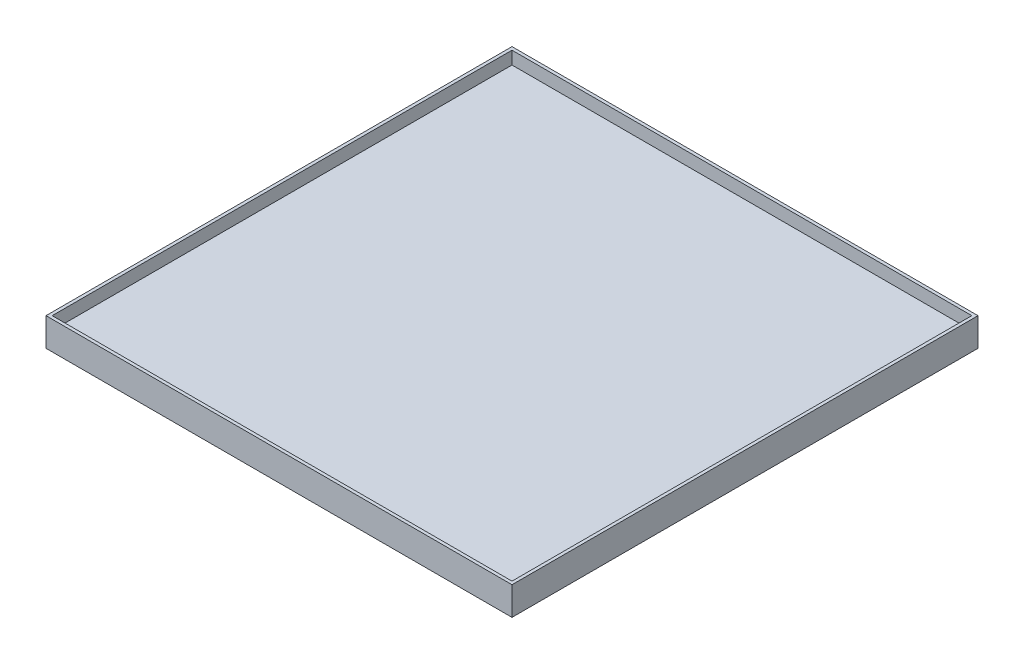
ISO-10303-21;
HEADER;
FILE_DESCRIPTION(('STEP AP214'),'2;1');
FILE_NAME('part.step','',(''),(''),'','','');
FILE_SCHEMA(('AUTOMOTIVE_DESIGN { 1 0 10303 214 1 1 1 1 }'));
ENDSEC;
DATA;
#1=APPLICATION_CONTEXT('core data for automotive mechanical design processes');
#2=APPLICATION_PROTOCOL_DEFINITION('international standard','automotive_design',2000,#1);
#3=PRODUCT_CONTEXT('',#1,'mechanical');
#4=PRODUCT('Part','Part','',(#3));
#5=PRODUCT_RELATED_PRODUCT_CATEGORY('part','',(#4));
#6=PRODUCT_DEFINITION_FORMATION('','',#4);
#7=PRODUCT_DEFINITION_CONTEXT('part definition',#1,'design');
#8=PRODUCT_DEFINITION('design','',#6,#7);
#9=PRODUCT_DEFINITION_SHAPE('','',#8);
#10=(LENGTH_UNIT() NAMED_UNIT(*) SI_UNIT(.MILLI.,.METRE.));
#11=(NAMED_UNIT(*) PLANE_ANGLE_UNIT() SI_UNIT($,.RADIAN.));
#12=(NAMED_UNIT(*) SI_UNIT($,.STERADIAN.) SOLID_ANGLE_UNIT());
#13=UNCERTAINTY_MEASURE_WITH_UNIT(LENGTH_MEASURE(1.E-05),#10,'distance_accuracy_value','');
#14=(GEOMETRIC_REPRESENTATION_CONTEXT(3) GLOBAL_UNCERTAINTY_ASSIGNED_CONTEXT((#13)) GLOBAL_UNIT_ASSIGNED_CONTEXT((#10,
#11,#12)) REPRESENTATION_CONTEXT('',''));
#15=CARTESIAN_POINT('',(0.,0.,0.));
#16=DIRECTION('',(0.,0.,1.));
#17=DIRECTION('',(1.,0.,0.));
#18=AXIS2_PLACEMENT_3D('',#15,#16,#17);
#19=CARTESIAN_POINT('',(0.,0.,0.));
#20=DIRECTION('',(0.,1.,0.));
#21=DIRECTION('',(0.,0.,1.));
#22=AXIS2_PLACEMENT_3D('',#19,#20,#21);
#23=PLANE('',#22);
#24=DIRECTION('',(0.,0.,-1.));
#25=VECTOR('',#24,1.);
#26=CARTESIAN_POINT('',(305.,0.,875.));
#27=LINE('',#26,#25);
#28=CARTESIAN_POINT('',(305.,0.,-305.));
#29=VERTEX_POINT('',#28);
#30=CARTESIAN_POINT('',(305.,0.,-875.));
#31=VERTEX_POINT('',#30);
#32=EDGE_CURVE('E361',#29,#31,#27,.T.);
#33=ORIENTED_EDGE('',*,*,#32,.F.);
#34=DIRECTION('',(1.,0.,0.));
#35=VECTOR('',#34,1.);
#36=CARTESIAN_POINT('',(-875.,0.,-305.));
#37=LINE('',#36,#35);
#38=CARTESIAN_POINT('',(-305.,0.,-305.));
#39=VERTEX_POINT('',#38);
#40=EDGE_CURVE('E469',#39,#29,#37,.T.);
#41=ORIENTED_EDGE('',*,*,#40,.F.);
#42=DIRECTION('',(0.,0.,1.));
#43=VECTOR('',#42,1.);
#44=CARTESIAN_POINT('',(-305.,0.,875.));
#45=LINE('',#44,#43);
#46=CARTESIAN_POINT('',(-305.,0.,-875.));
#47=VERTEX_POINT('',#46);
#48=EDGE_CURVE('E426',#47,#39,#45,.T.);
#49=ORIENTED_EDGE('',*,*,#48,.F.);
#50=DIRECTION('',(1.,0.,0.));
#51=VECTOR('',#50,1.);
#52=CARTESIAN_POINT('',(-875.,0.,-875.));
#53=LINE('',#52,#51);
#54=EDGE_CURVE('E552',#47,#31,#53,.T.);
#55=ORIENTED_EDGE('',*,*,#54,.T.);
#56=EDGE_LOOP('',(#33,#41,#49,#55));
#57=FACE_BOUND('',#56,.T.);
#58=ADVANCED_FACE('F33',(#57),#23,.F.);
#59=DIRECTION('',(0.,0.,1.));
#60=VECTOR('',#59,1.);
#61=CARTESIAN_POINT('',(335.,0.,875.));
#62=LINE('',#61,#60);
#63=CARTESIAN_POINT('',(335.,0.,-875.));
#64=VERTEX_POINT('',#63);
#65=CARTESIAN_POINT('',(335.,0.,-305.));
#66=VERTEX_POINT('',#65);
#67=EDGE_CURVE('E378',#64,#66,#62,.T.);
#68=ORIENTED_EDGE('',*,*,#67,.F.);
#69=CARTESIAN_POINT('',(875.,0.,-875.));
#70=VERTEX_POINT('',#69);
#71=EDGE_CURVE('E546',#64,#70,#53,.T.);
#72=ORIENTED_EDGE('',*,*,#71,.T.);
#73=DIRECTION('',(0.,0.,1.));
#74=VECTOR('',#73,1.);
#75=CARTESIAN_POINT('',(875.,0.,875.));
#76=LINE('',#75,#74);
#77=CARTESIAN_POINT('',(875.,0.,-305.));
#78=VERTEX_POINT('',#77);
#79=EDGE_CURVE('E553',#70,#78,#76,.T.);
#80=ORIENTED_EDGE('',*,*,#79,.T.);
#81=EDGE_CURVE('E453',#66,#78,#37,.T.);
#82=ORIENTED_EDGE('',*,*,#81,.F.);
#83=EDGE_LOOP('',(#68,#72,#80,#82));
#84=FACE_BOUND('',#83,.T.);
#85=ADVANCED_FACE('F689',(#84),#23,.F.);
#86=CARTESIAN_POINT('',(305.,0.,275.));
#87=VERTEX_POINT('',#86);
#88=CARTESIAN_POINT('',(305.,0.,-275.));
#89=VERTEX_POINT('',#88);
#90=EDGE_CURVE('E377',#87,#89,#27,.T.);
#91=ORIENTED_EDGE('',*,*,#90,.F.);
#92=DIRECTION('',(1.,0.,0.));
#93=VECTOR('',#92,1.);
#94=CARTESIAN_POINT('',(-875.,0.,275.));
#95=LINE('',#94,#93);
#96=CARTESIAN_POINT('',(-305.,0.,275.));
#97=VERTEX_POINT('',#96);
#98=EDGE_CURVE('E501',#97,#87,#95,.T.);
#99=ORIENTED_EDGE('',*,*,#98,.F.);
#100=CARTESIAN_POINT('',(-305.,0.,-275.));
#101=VERTEX_POINT('',#100);
#102=EDGE_CURVE('E428',#101,#97,#45,.T.);
#103=ORIENTED_EDGE('',*,*,#102,.F.);
#104=DIRECTION('',(-1.,0.,0.));
#105=VECTOR('',#104,1.);
#106=CARTESIAN_POINT('',(-875.,0.,-275.));
#107=LINE('',#106,#105);
#108=EDGE_CURVE('E473',#89,#101,#107,.T.);
#109=ORIENTED_EDGE('',*,*,#108,.F.);
#110=EDGE_LOOP('',(#91,#99,#103,#109));
#111=FACE_BOUND('',#110,.T.);
#112=ADVANCED_FACE('F601',(#111),#23,.F.);
#113=CARTESIAN_POINT('',(335.,0.,-275.));
#114=VERTEX_POINT('',#113);
#115=CARTESIAN_POINT('',(335.,0.,275.));
#116=VERTEX_POINT('',#115);
#117=EDGE_CURVE('E381',#114,#116,#62,.T.);
#118=ORIENTED_EDGE('',*,*,#117,.F.);
#119=CARTESIAN_POINT('',(875.,0.,-275.));
#120=VERTEX_POINT('',#119);
#121=EDGE_CURVE('E470',#120,#114,#107,.T.);
#122=ORIENTED_EDGE('',*,*,#121,.F.);
#123=CARTESIAN_POINT('',(875.,0.,275.000000000001));
#124=VERTEX_POINT('',#123);
#125=EDGE_CURVE('E556',#120,#124,#76,.T.);
#126=ORIENTED_EDGE('',*,*,#125,.T.);
#127=EDGE_CURVE('E485',#116,#124,#95,.T.);
#128=ORIENTED_EDGE('',*,*,#127,.F.);
#129=EDGE_LOOP('',(#118,#122,#126,#128));
#130=FACE_BOUND('',#129,.T.);
#131=ADVANCED_FACE('F645',(#130),#23,.F.);
#132=CARTESIAN_POINT('',(305.,0.,875.));
#133=VERTEX_POINT('',#132);
#134=CARTESIAN_POINT('',(305.,0.,305.));
#135=VERTEX_POINT('',#134);
#136=EDGE_CURVE('E373',#133,#135,#27,.T.);
#137=ORIENTED_EDGE('',*,*,#136,.F.);
#138=DIRECTION('',(-1.,0.,0.));
#139=VECTOR('',#138,1.);
#140=CARTESIAN_POINT('',(-875.,0.,875.));
#141=LINE('',#140,#139);
#142=CARTESIAN_POINT('',(-305.,0.,875.));
#143=VERTEX_POINT('',#142);
#144=EDGE_CURVE('E542',#133,#143,#141,.T.);
#145=ORIENTED_EDGE('',*,*,#144,.T.);
#146=CARTESIAN_POINT('',(-305.,0.,305.));
#147=VERTEX_POINT('',#146);
#148=EDGE_CURVE('E424',#147,#143,#45,.T.);
#149=ORIENTED_EDGE('',*,*,#148,.F.);
#150=DIRECTION('',(-1.,0.,0.));
#151=VECTOR('',#150,1.);
#152=CARTESIAN_POINT('',(-875.,0.,305.));
#153=LINE('',#152,#151);
#154=EDGE_CURVE('E505',#135,#147,#153,.T.);
#155=ORIENTED_EDGE('',*,*,#154,.F.);
#156=EDGE_LOOP('',(#137,#145,#149,#155));
#157=FACE_BOUND('',#156,.T.);
#158=ADVANCED_FACE('F859',(#157),#23,.F.);
#159=CARTESIAN_POINT('',(335.,0.,305.));
#160=VERTEX_POINT('',#159);
#161=CARTESIAN_POINT('',(335.,0.,875.));
#162=VERTEX_POINT('',#161);
#163=EDGE_CURVE('E376',#160,#162,#62,.T.);
#164=ORIENTED_EDGE('',*,*,#163,.F.);
#165=CARTESIAN_POINT('',(875.,0.,305.));
#166=VERTEX_POINT('',#165);
#167=EDGE_CURVE('E502',#166,#160,#153,.T.);
#168=ORIENTED_EDGE('',*,*,#167,.F.);
#169=CARTESIAN_POINT('',(875.,0.,875.));
#170=VERTEX_POINT('',#169);
#171=EDGE_CURVE('E551',#166,#170,#76,.T.);
#172=ORIENTED_EDGE('',*,*,#171,.T.);
#173=EDGE_CURVE('E538',#170,#162,#141,.T.);
#174=ORIENTED_EDGE('',*,*,#173,.T.);
#175=EDGE_LOOP('',(#164,#168,#172,#174));
#176=FACE_BOUND('',#175,.T.);
#177=ADVANCED_FACE('F648',(#176),#23,.F.);
#178=CARTESIAN_POINT('',(-875.,-50.,875.));
#179=DIRECTION('',(0.,0.,-1.));
#180=DIRECTION('',(-1.,0.,0.));
#181=AXIS2_PLACEMENT_3D('',#178,#179,#180);
#182=PLANE('',#181);
#183=ORIENTED_EDGE('',*,*,#144,.F.);
#184=DIRECTION('',(0.,1.,0.));
#185=VECTOR('',#184,1.);
#186=CARTESIAN_POINT('',(305.,-50.,875.));
#187=LINE('',#186,#185);
#188=CARTESIAN_POINT('',(305.,-50.,875.));
#189=VERTEX_POINT('',#188);
#190=EDGE_CURVE('E371',#189,#133,#187,.T.);
#191=ORIENTED_EDGE('',*,*,#190,.F.);
#192=DIRECTION('',(-1.,0.,0.));
#193=VECTOR('',#192,1.);
#194=CARTESIAN_POINT('',(-875.,-50.,875.));
#195=LINE('',#194,#193);
#196=CARTESIAN_POINT('',(-305.,-50.,875.));
#197=VERTEX_POINT('',#196);
#198=EDGE_CURVE('E521',#189,#197,#195,.T.);
#199=ORIENTED_EDGE('',*,*,#198,.T.);
#200=DIRECTION('',(0.,1.,0.));
#201=VECTOR('',#200,1.);
#202=CARTESIAN_POINT('',(-305.,-50.,875.));
#203=LINE('',#202,#201);
#204=EDGE_CURVE('E430',#197,#143,#203,.T.);
#205=ORIENTED_EDGE('',*,*,#204,.T.);
#206=EDGE_LOOP('',(#183,#191,#199,#205));
#207=FACE_BOUND('',#206,.T.);
#208=ADVANCED_FACE('F614',(#207),#182,.T.);
#209=CARTESIAN_POINT('',(875.,-50.,875.));
#210=VERTEX_POINT('',#209);
#211=CARTESIAN_POINT('',(335.,-50.,875.));
#212=VERTEX_POINT('',#211);
#213=EDGE_CURVE('E518',#210,#212,#195,.T.);
#214=ORIENTED_EDGE('',*,*,#213,.T.);
#215=DIRECTION('',(0.,1.,0.));
#216=VECTOR('',#215,1.);
#217=CARTESIAN_POINT('',(335.,-50.,875.));
#218=LINE('',#217,#216);
#219=EDGE_CURVE('E384',#212,#162,#218,.T.);
#220=ORIENTED_EDGE('',*,*,#219,.T.);
#221=ORIENTED_EDGE('',*,*,#173,.F.);
#222=DIRECTION('',(0.,1.,0.));
#223=VECTOR('',#222,1.);
#224=CARTESIAN_POINT('',(875.,-50.,875.));
#225=LINE('',#224,#223);
#226=EDGE_CURVE('E536',#210,#170,#225,.T.);
#227=ORIENTED_EDGE('',*,*,#226,.F.);
#228=EDGE_LOOP('',(#214,#220,#221,#227));
#229=FACE_BOUND('',#228,.T.);
#230=ADVANCED_FACE('F657',(#229),#182,.T.);
#231=CARTESIAN_POINT('',(-875.,-50.,-875.));
#232=DIRECTION('',(0.,0.,1.));
#233=DIRECTION('',(1.,0.,0.));
#234=AXIS2_PLACEMENT_3D('',#231,#232,#233);
#235=PLANE('',#234);
#236=DIRECTION('',(1.,0.,0.));
#237=VECTOR('',#236,1.);
#238=CARTESIAN_POINT('',(-875.,-50.,-875.));
#239=LINE('',#238,#237);
#240=CARTESIAN_POINT('',(-305.,-50.,-875.));
#241=VERTEX_POINT('',#240);
#242=CARTESIAN_POINT('',(305.,-50.,-875.));
#243=VERTEX_POINT('',#242);
#244=EDGE_CURVE('E532',#241,#243,#239,.T.);
#245=ORIENTED_EDGE('',*,*,#244,.T.);
#246=DIRECTION('',(0.,1.,0.));
#247=VECTOR('',#246,1.);
#248=CARTESIAN_POINT('',(305.,-50.,-875.));
#249=LINE('',#248,#247);
#250=EDGE_CURVE('E389',#243,#31,#249,.T.);
#251=ORIENTED_EDGE('',*,*,#250,.T.);
#252=ORIENTED_EDGE('',*,*,#54,.F.);
#253=DIRECTION('',(0.,1.,0.));
#254=VECTOR('',#253,1.);
#255=CARTESIAN_POINT('',(-305.,-50.,-875.));
#256=LINE('',#255,#254);
#257=EDGE_CURVE('E433',#241,#47,#256,.T.);
#258=ORIENTED_EDGE('',*,*,#257,.F.);
#259=EDGE_LOOP('',(#245,#251,#252,#258));
#260=FACE_BOUND('',#259,.T.);
#261=ADVANCED_FACE('F814',(#260),#235,.T.);
#262=ORIENTED_EDGE('',*,*,#71,.F.);
#263=DIRECTION('',(0.,1.,0.));
#264=VECTOR('',#263,1.);
#265=CARTESIAN_POINT('',(335.,-50.,-875.));
#266=LINE('',#265,#264);
#267=CARTESIAN_POINT('',(335.,-50.,-875.));
#268=VERTEX_POINT('',#267);
#269=EDGE_CURVE('E386',#268,#64,#266,.T.);
#270=ORIENTED_EDGE('',*,*,#269,.F.);
#271=CARTESIAN_POINT('',(875.,-50.,-875.));
#272=VERTEX_POINT('',#271);
#273=EDGE_CURVE('E526',#268,#272,#239,.T.);
#274=ORIENTED_EDGE('',*,*,#273,.T.);
#275=DIRECTION('',(0.,1.,0.));
#276=VECTOR('',#275,1.);
#277=CARTESIAN_POINT('',(875.,-50.,-875.));
#278=LINE('',#277,#276);
#279=EDGE_CURVE('E559',#272,#70,#278,.T.);
#280=ORIENTED_EDGE('',*,*,#279,.T.);
#281=EDGE_LOOP('',(#262,#270,#274,#280));
#282=FACE_BOUND('',#281,.T.);
#283=ADVANCED_FACE('F807',(#282),#235,.T.);
#284=CARTESIAN_POINT('',(-875.,-50.,275.));
#285=DIRECTION('',(0.,0.,1.));
#286=DIRECTION('',(1.,0.,0.));
#287=AXIS2_PLACEMENT_3D('',#284,#285,#286);
#288=PLANE('',#287);
#289=DIRECTION('',(0.,1.,0.));
#290=VECTOR('',#289,1.);
#291=CARTESIAN_POINT('',(305.,-50.,275.));
#292=LINE('',#291,#290);
#293=CARTESIAN_POINT('',(305.,-50.,275.));
#294=VERTEX_POINT('',#293);
#295=EDGE_CURVE('E410',#294,#87,#292,.T.);
#296=ORIENTED_EDGE('',*,*,#295,.F.);
#297=DIRECTION('',(1.,0.,0.));
#298=VECTOR('',#297,1.);
#299=CARTESIAN_POINT('',(-875.,-50.,275.));
#300=LINE('',#299,#298);
#301=CARTESIAN_POINT('',(-305.,-50.,275.));
#302=VERTEX_POINT('',#301);
#303=EDGE_CURVE('E490',#302,#294,#300,.T.);
#304=ORIENTED_EDGE('',*,*,#303,.F.);
#305=DIRECTION('',(0.,-1.,0.));
#306=VECTOR('',#305,1.);
#307=CARTESIAN_POINT('',(-305.,-50.,275.));
#308=LINE('',#307,#306);
#309=EDGE_CURVE('E444',#97,#302,#308,.T.);
#310=ORIENTED_EDGE('',*,*,#309,.F.);
#311=ORIENTED_EDGE('',*,*,#98,.T.);
#312=EDGE_LOOP('',(#296,#304,#310,#311));
#313=FACE_BOUND('',#312,.T.);
#314=ADVANCED_FACE('F627',(#313),#288,.F.);
#315=DIRECTION('',(0.,-1.,0.));
#316=VECTOR('',#315,1.);
#317=CARTESIAN_POINT('',(335.,-50.,275.));
#318=LINE('',#317,#316);
#319=CARTESIAN_POINT('',(335.,-50.,275.));
#320=VERTEX_POINT('',#319);
#321=EDGE_CURVE('E399',#116,#320,#318,.T.);
#322=ORIENTED_EDGE('',*,*,#321,.F.);
#323=ORIENTED_EDGE('',*,*,#127,.T.);
#324=DIRECTION('',(0.,1.,0.));
#325=VECTOR('',#324,1.);
#326=CARTESIAN_POINT('',(875.,-50.,275.000000000001));
#327=LINE('',#326,#325);
#328=CARTESIAN_POINT('',(875.,-50.,275.));
#329=VERTEX_POINT('',#328);
#330=EDGE_CURVE('E511',#329,#124,#327,.T.);
#331=ORIENTED_EDGE('',*,*,#330,.F.);
#332=EDGE_CURVE('E491',#320,#329,#300,.T.);
#333=ORIENTED_EDGE('',*,*,#332,.F.);
#334=EDGE_LOOP('',(#322,#323,#331,#333));
#335=FACE_BOUND('',#334,.T.);
#336=ADVANCED_FACE('F640',(#335),#288,.F.);
#337=CARTESIAN_POINT('',(-875.,-50.,305.));
#338=DIRECTION('',(0.,0.,-1.));
#339=DIRECTION('',(-1.,0.,0.));
#340=AXIS2_PLACEMENT_3D('',#337,#338,#339);
#341=PLANE('',#340);
#342=DIRECTION('',(0.,-1.,0.));
#343=VECTOR('',#342,1.);
#344=CARTESIAN_POINT('',(305.,-50.,305.));
#345=LINE('',#344,#343);
#346=CARTESIAN_POINT('',(305.,-50.,305.));
#347=VERTEX_POINT('',#346);
#348=EDGE_CURVE('E407',#135,#347,#345,.T.);
#349=ORIENTED_EDGE('',*,*,#348,.F.);
#350=ORIENTED_EDGE('',*,*,#154,.T.);
#351=DIRECTION('',(0.,1.,0.));
#352=VECTOR('',#351,1.);
#353=CARTESIAN_POINT('',(-305.,-50.,305.));
#354=LINE('',#353,#352);
#355=CARTESIAN_POINT('',(-305.,-50.,305.));
#356=VERTEX_POINT('',#355);
#357=EDGE_CURVE('E441',#356,#147,#354,.T.);
#358=ORIENTED_EDGE('',*,*,#357,.F.);
#359=DIRECTION('',(-1.,0.,0.));
#360=VECTOR('',#359,1.);
#361=CARTESIAN_POINT('',(-875.,-50.,305.));
#362=LINE('',#361,#360);
#363=EDGE_CURVE('E496',#347,#356,#362,.T.);
#364=ORIENTED_EDGE('',*,*,#363,.F.);
#365=EDGE_LOOP('',(#349,#350,#358,#364));
#366=FACE_BOUND('',#365,.T.);
#367=ADVANCED_FACE('F858',(#366),#341,.F.);
#368=DIRECTION('',(0.,1.,0.));
#369=VECTOR('',#368,1.);
#370=CARTESIAN_POINT('',(335.,-50.,305.));
#371=LINE('',#370,#369);
#372=CARTESIAN_POINT('',(335.,-50.,305.));
#373=VERTEX_POINT('',#372);
#374=EDGE_CURVE('E396',#373,#160,#371,.T.);
#375=ORIENTED_EDGE('',*,*,#374,.F.);
#376=CARTESIAN_POINT('',(875.,-50.,305.000000000001));
#377=VERTEX_POINT('',#376);
#378=EDGE_CURVE('E492',#377,#373,#362,.T.);
#379=ORIENTED_EDGE('',*,*,#378,.F.);
#380=DIRECTION('',(0.,1.,0.));
#381=VECTOR('',#380,1.);
#382=CARTESIAN_POINT('',(875.,-50.,305.000000000001));
#383=LINE('',#382,#381);
#384=EDGE_CURVE('E508',#377,#166,#383,.T.);
#385=ORIENTED_EDGE('',*,*,#384,.T.);
#386=ORIENTED_EDGE('',*,*,#167,.T.);
#387=EDGE_LOOP('',(#375,#379,#385,#386));
#388=FACE_BOUND('',#387,.T.);
#389=ADVANCED_FACE('F1096',(#388),#341,.F.);
#390=CARTESIAN_POINT('',(-875.,-50.,-305.));
#391=DIRECTION('',(0.,0.,1.));
#392=DIRECTION('',(1.,0.,0.));
#393=AXIS2_PLACEMENT_3D('',#390,#391,#392);
#394=PLANE('',#393);
#395=DIRECTION('',(0.,1.,0.));
#396=VECTOR('',#395,1.);
#397=CARTESIAN_POINT('',(305.,-50.,-305.));
#398=LINE('',#397,#396);
#399=CARTESIAN_POINT('',(305.,-50.,-305.));
#400=VERTEX_POINT('',#399);
#401=EDGE_CURVE('E404',#400,#29,#398,.T.);
#402=ORIENTED_EDGE('',*,*,#401,.F.);
#403=DIRECTION('',(1.,0.,0.));
#404=VECTOR('',#403,1.);
#405=CARTESIAN_POINT('',(-875.,-50.,-305.));
#406=LINE('',#405,#404);
#407=CARTESIAN_POINT('',(-305.,-50.,-305.));
#408=VERTEX_POINT('',#407);
#409=EDGE_CURVE('E458',#408,#400,#406,.T.);
#410=ORIENTED_EDGE('',*,*,#409,.F.);
#411=DIRECTION('',(0.,-1.,0.));
#412=VECTOR('',#411,1.);
#413=CARTESIAN_POINT('',(-305.,-50.,-305.));
#414=LINE('',#413,#412);
#415=EDGE_CURVE('E438',#39,#408,#414,.T.);
#416=ORIENTED_EDGE('',*,*,#415,.F.);
#417=ORIENTED_EDGE('',*,*,#40,.T.);
#418=EDGE_LOOP('',(#402,#410,#416,#417));
#419=FACE_BOUND('',#418,.T.);
#420=ADVANCED_FACE('F793',(#419),#394,.F.);
#421=DIRECTION('',(0.,-1.,0.));
#422=VECTOR('',#421,1.);
#423=CARTESIAN_POINT('',(335.,-50.,-305.));
#424=LINE('',#423,#422);
#425=CARTESIAN_POINT('',(335.,-50.,-305.));
#426=VERTEX_POINT('',#425);
#427=EDGE_CURVE('E393',#66,#426,#424,.T.);
#428=ORIENTED_EDGE('',*,*,#427,.F.);
#429=ORIENTED_EDGE('',*,*,#81,.T.);
#430=DIRECTION('',(0.,1.,0.));
#431=VECTOR('',#430,1.);
#432=CARTESIAN_POINT('',(875.,-50.,-305.));
#433=LINE('',#432,#431);
#434=CARTESIAN_POINT('',(875.,-50.,-305.));
#435=VERTEX_POINT('',#434);
#436=EDGE_CURVE('E479',#435,#78,#433,.T.);
#437=ORIENTED_EDGE('',*,*,#436,.F.);
#438=EDGE_CURVE('E459',#426,#435,#406,.T.);
#439=ORIENTED_EDGE('',*,*,#438,.F.);
#440=EDGE_LOOP('',(#428,#429,#437,#439));
#441=FACE_BOUND('',#440,.T.);
#442=ADVANCED_FACE('F681',(#441),#394,.F.);
#443=CARTESIAN_POINT('',(-875.,-50.,-275.));
#444=DIRECTION('',(0.,0.,-1.));
#445=DIRECTION('',(-1.,0.,0.));
#446=AXIS2_PLACEMENT_3D('',#443,#444,#445);
#447=PLANE('',#446);
#448=DIRECTION('',(0.,-1.,0.));
#449=VECTOR('',#448,1.);
#450=CARTESIAN_POINT('',(305.,-50.,-275.));
#451=LINE('',#450,#449);
#452=CARTESIAN_POINT('',(305.,-50.,-275.));
#453=VERTEX_POINT('',#452);
#454=EDGE_CURVE('E401',#89,#453,#451,.T.);
#455=ORIENTED_EDGE('',*,*,#454,.F.);
#456=ORIENTED_EDGE('',*,*,#108,.T.);
#457=DIRECTION('',(0.,1.,0.));
#458=VECTOR('',#457,1.);
#459=CARTESIAN_POINT('',(-305.,-50.,-275.));
#460=LINE('',#459,#458);
#461=CARTESIAN_POINT('',(-305.,-50.,-275.));
#462=VERTEX_POINT('',#461);
#463=EDGE_CURVE('E41',#462,#101,#460,.T.);
#464=ORIENTED_EDGE('',*,*,#463,.F.);
#465=DIRECTION('',(-1.,0.,0.));
#466=VECTOR('',#465,1.);
#467=CARTESIAN_POINT('',(-875.,-50.,-275.));
#468=LINE('',#467,#466);
#469=EDGE_CURVE('E464',#453,#462,#468,.T.);
#470=ORIENTED_EDGE('',*,*,#469,.F.);
#471=EDGE_LOOP('',(#455,#456,#464,#470));
#472=FACE_BOUND('',#471,.T.);
#473=ADVANCED_FACE('F670',(#472),#447,.F.);
#474=DIRECTION('',(0.,1.,0.));
#475=VECTOR('',#474,1.);
#476=CARTESIAN_POINT('',(335.,-50.,-275.));
#477=LINE('',#476,#475);
#478=CARTESIAN_POINT('',(335.,-50.,-275.));
#479=VERTEX_POINT('',#478);
#480=EDGE_CURVE('E391',#479,#114,#477,.T.);
#481=ORIENTED_EDGE('',*,*,#480,.F.);
#482=CARTESIAN_POINT('',(875.,-50.,-275.));
#483=VERTEX_POINT('',#482);
#484=EDGE_CURVE('E460',#483,#479,#468,.T.);
#485=ORIENTED_EDGE('',*,*,#484,.F.);
#486=DIRECTION('',(0.,1.,0.));
#487=VECTOR('',#486,1.);
#488=CARTESIAN_POINT('',(875.,-50.,-275.));
#489=LINE('',#488,#487);
#490=EDGE_CURVE('E476',#483,#120,#489,.T.);
#491=ORIENTED_EDGE('',*,*,#490,.T.);
#492=ORIENTED_EDGE('',*,*,#121,.T.);
#493=EDGE_LOOP('',(#481,#485,#491,#492));
#494=FACE_BOUND('',#493,.T.);
#495=ADVANCED_FACE('F667',(#494),#447,.F.);
#496=DIRECTION('',(0.,0.,-1.));
#497=VECTOR('',#496,1.);
#498=CARTESIAN_POINT('',(-335.,0.,875.));
#499=LINE('',#498,#497);
#500=CARTESIAN_POINT('',(-335.,0.,-305.));
#501=VERTEX_POINT('',#500);
#502=CARTESIAN_POINT('',(-335.,0.,-875.));
#503=VERTEX_POINT('',#502);
#504=EDGE_CURVE('E412',#501,#503,#499,.T.);
#505=ORIENTED_EDGE('',*,*,#504,.F.);
#506=CARTESIAN_POINT('',(-875.,0.,-305.));
#507=VERTEX_POINT('',#506);
#508=EDGE_CURVE('E465',#507,#501,#37,.T.);
#509=ORIENTED_EDGE('',*,*,#508,.F.);
#510=DIRECTION('',(0.,0.,-1.));
#511=VECTOR('',#510,1.);
#512=CARTESIAN_POINT('',(-875.,0.,875.));
#513=LINE('',#512,#511);
#514=CARTESIAN_POINT('',(-875.,0.,-875.));
#515=VERTEX_POINT('',#514);
#516=EDGE_CURVE('E541',#507,#515,#513,.T.);
#517=ORIENTED_EDGE('',*,*,#516,.T.);
#518=EDGE_CURVE('E548',#515,#503,#53,.T.);
#519=ORIENTED_EDGE('',*,*,#518,.T.);
#520=EDGE_LOOP('',(#505,#509,#517,#519));
#521=FACE_BOUND('',#520,.T.);
#522=ADVANCED_FACE('F669',(#521),#23,.F.);
#523=CARTESIAN_POINT('',(-335.,0.,275.));
#524=VERTEX_POINT('',#523);
#525=CARTESIAN_POINT('',(-335.,0.,-275.));
#526=VERTEX_POINT('',#525);
#527=EDGE_CURVE('E425',#524,#526,#499,.T.);
#528=ORIENTED_EDGE('',*,*,#527,.F.);
#529=CARTESIAN_POINT('',(-875.,0.,275.));
#530=VERTEX_POINT('',#529);
#531=EDGE_CURVE('E497',#530,#524,#95,.T.);
#532=ORIENTED_EDGE('',*,*,#531,.F.);
#533=CARTESIAN_POINT('',(-875.,0.,-275.));
#534=VERTEX_POINT('',#533);
#535=EDGE_CURVE('E547',#530,#534,#513,.T.);
#536=ORIENTED_EDGE('',*,*,#535,.T.);
#537=EDGE_CURVE('E468',#526,#534,#107,.T.);
#538=ORIENTED_EDGE('',*,*,#537,.F.);
#539=EDGE_LOOP('',(#528,#532,#536,#538));
#540=FACE_BOUND('',#539,.T.);
#541=ADVANCED_FACE('F677',(#540),#23,.F.);
#542=CARTESIAN_POINT('',(-335.,0.,875.));
#543=VERTEX_POINT('',#542);
#544=CARTESIAN_POINT('',(-335.,0.,305.));
#545=VERTEX_POINT('',#544);
#546=EDGE_CURVE('E422',#543,#545,#499,.T.);
#547=ORIENTED_EDGE('',*,*,#546,.F.);
#548=CARTESIAN_POINT('',(-875.,0.,875.));
#549=VERTEX_POINT('',#548);
#550=EDGE_CURVE('E517',#543,#549,#141,.T.);
#551=ORIENTED_EDGE('',*,*,#550,.T.);
#552=CARTESIAN_POINT('',(-875.,0.,305.));
#553=VERTEX_POINT('',#552);
#554=EDGE_CURVE('E543',#549,#553,#513,.T.);
#555=ORIENTED_EDGE('',*,*,#554,.T.);
#556=EDGE_CURVE('E500',#545,#553,#153,.T.);
#557=ORIENTED_EDGE('',*,*,#556,.F.);
#558=EDGE_LOOP('',(#547,#551,#555,#557));
#559=FACE_BOUND('',#558,.T.);
#560=ADVANCED_FACE('F680',(#559),#23,.F.);
#561=ORIENTED_EDGE('',*,*,#550,.F.);
#562=DIRECTION('',(0.,1.,0.));
#563=VECTOR('',#562,1.);
#564=CARTESIAN_POINT('',(-335.,-50.,875.));
#565=LINE('',#564,#563);
#566=CARTESIAN_POINT('',(-335.,-50.,875.));
#567=VERTEX_POINT('',#566);
#568=EDGE_CURVE('E420',#567,#543,#565,.T.);
#569=ORIENTED_EDGE('',*,*,#568,.F.);
#570=CARTESIAN_POINT('',(-875.,-50.,875.));
#571=VERTEX_POINT('',#570);
#572=EDGE_CURVE('E522',#567,#571,#195,.T.);
#573=ORIENTED_EDGE('',*,*,#572,.T.);
#574=DIRECTION('',(0.,1.,0.));
#575=VECTOR('',#574,1.);
#576=CARTESIAN_POINT('',(-875.,-50.,875.));
#577=LINE('',#576,#575);
#578=EDGE_CURVE('E565',#571,#549,#577,.T.);
#579=ORIENTED_EDGE('',*,*,#578,.T.);
#580=EDGE_LOOP('',(#561,#569,#573,#579));
#581=FACE_BOUND('',#580,.T.);
#582=ADVANCED_FACE('F823',(#581),#182,.T.);
#583=CARTESIAN_POINT('',(-875.,-50.,-875.));
#584=VERTEX_POINT('',#583);
#585=CARTESIAN_POINT('',(-335.,-50.,-875.));
#586=VERTEX_POINT('',#585);
#587=EDGE_CURVE('E528',#584,#586,#239,.T.);
#588=ORIENTED_EDGE('',*,*,#587,.T.);
#589=DIRECTION('',(0.,1.,0.));
#590=VECTOR('',#589,1.);
#591=CARTESIAN_POINT('',(-335.,-50.,-875.));
#592=LINE('',#591,#590);
#593=EDGE_CURVE('E435',#586,#503,#592,.T.);
#594=ORIENTED_EDGE('',*,*,#593,.T.);
#595=ORIENTED_EDGE('',*,*,#518,.F.);
#596=DIRECTION('',(0.,1.,0.));
#597=VECTOR('',#596,1.);
#598=CARTESIAN_POINT('',(-875.,-50.,-875.));
#599=LINE('',#598,#597);
#600=EDGE_CURVE('E562',#584,#515,#599,.T.);
#601=ORIENTED_EDGE('',*,*,#600,.F.);
#602=EDGE_LOOP('',(#588,#594,#595,#601));
#603=FACE_BOUND('',#602,.T.);
#604=ADVANCED_FACE('F817',(#603),#235,.T.);
#605=DIRECTION('',(0.,1.,0.));
#606=VECTOR('',#605,1.);
#607=CARTESIAN_POINT('',(-335.,-50.,275.));
#608=LINE('',#607,#606);
#609=CARTESIAN_POINT('',(-335.,-50.,275.));
#610=VERTEX_POINT('',#609);
#611=EDGE_CURVE('E451',#610,#524,#608,.T.);
#612=ORIENTED_EDGE('',*,*,#611,.F.);
#613=CARTESIAN_POINT('',(-875.,-50.,275.));
#614=VERTEX_POINT('',#613);
#615=EDGE_CURVE('E486',#614,#610,#300,.T.);
#616=ORIENTED_EDGE('',*,*,#615,.F.);
#617=DIRECTION('',(0.,1.,0.));
#618=VECTOR('',#617,1.);
#619=CARTESIAN_POINT('',(-875.,-50.,275.));
#620=LINE('',#619,#618);
#621=EDGE_CURVE('E514',#614,#530,#620,.T.);
#622=ORIENTED_EDGE('',*,*,#621,.T.);
#623=ORIENTED_EDGE('',*,*,#531,.T.);
#624=EDGE_LOOP('',(#612,#616,#622,#623));
#625=FACE_BOUND('',#624,.T.);
#626=ADVANCED_FACE('F827',(#625),#288,.F.);
#627=DIRECTION('',(0.,-1.,0.));
#628=VECTOR('',#627,1.);
#629=CARTESIAN_POINT('',(-335.,-50.,305.));
#630=LINE('',#629,#628);
#631=CARTESIAN_POINT('',(-335.,-50.,305.));
#632=VERTEX_POINT('',#631);
#633=EDGE_CURVE('E448',#545,#632,#630,.T.);
#634=ORIENTED_EDGE('',*,*,#633,.F.);
#635=ORIENTED_EDGE('',*,*,#556,.T.);
#636=DIRECTION('',(0.,1.,0.));
#637=VECTOR('',#636,1.);
#638=CARTESIAN_POINT('',(-875.,-50.,305.));
#639=LINE('',#638,#637);
#640=CARTESIAN_POINT('',(-875.,-50.,305.000000000001));
#641=VERTEX_POINT('',#640);
#642=EDGE_CURVE('E495',#641,#553,#639,.T.);
#643=ORIENTED_EDGE('',*,*,#642,.F.);
#644=EDGE_CURVE('E489',#632,#641,#362,.T.);
#645=ORIENTED_EDGE('',*,*,#644,.F.);
#646=EDGE_LOOP('',(#634,#635,#643,#645));
#647=FACE_BOUND('',#646,.T.);
#648=ADVANCED_FACE('F833',(#647),#341,.F.);
#649=DIRECTION('',(0.,1.,0.));
#650=VECTOR('',#649,1.);
#651=CARTESIAN_POINT('',(-335.,-50.,-305.));
#652=LINE('',#651,#650);
#653=CARTESIAN_POINT('',(-335.,-50.,-305.));
#654=VERTEX_POINT('',#653);
#655=EDGE_CURVE('E446',#654,#501,#652,.T.);
#656=ORIENTED_EDGE('',*,*,#655,.F.);
#657=CARTESIAN_POINT('',(-875.,-50.,-305.));
#658=VERTEX_POINT('',#657);
#659=EDGE_CURVE('E454',#658,#654,#406,.T.);
#660=ORIENTED_EDGE('',*,*,#659,.F.);
#661=DIRECTION('',(0.,1.,0.));
#662=VECTOR('',#661,1.);
#663=CARTESIAN_POINT('',(-875.,-50.,-305.));
#664=LINE('',#663,#662);
#665=EDGE_CURVE('E482',#658,#507,#664,.T.);
#666=ORIENTED_EDGE('',*,*,#665,.T.);
#667=ORIENTED_EDGE('',*,*,#508,.T.);
#668=EDGE_LOOP('',(#656,#660,#666,#667));
#669=FACE_BOUND('',#668,.T.);
#670=ADVANCED_FACE('F686',(#669),#394,.F.);
#671=DIRECTION('',(0.,-1.,0.));
#672=VECTOR('',#671,1.);
#673=CARTESIAN_POINT('',(-335.,-50.,-275.));
#674=LINE('',#673,#672);
#675=CARTESIAN_POINT('',(-335.,-50.,-275.));
#676=VERTEX_POINT('',#675);
#677=EDGE_CURVE('E11',#526,#676,#674,.T.);
#678=ORIENTED_EDGE('',*,*,#677,.F.);
#679=ORIENTED_EDGE('',*,*,#537,.T.);
#680=DIRECTION('',(0.,1.,0.));
#681=VECTOR('',#680,1.);
#682=CARTESIAN_POINT('',(-875.,-50.,-275.));
#683=LINE('',#682,#681);
#684=CARTESIAN_POINT('',(-875.,-50.,-275.));
#685=VERTEX_POINT('',#684);
#686=EDGE_CURVE('E463',#685,#534,#683,.T.);
#687=ORIENTED_EDGE('',*,*,#686,.F.);
#688=EDGE_CURVE('E457',#676,#685,#468,.T.);
#689=ORIENTED_EDGE('',*,*,#688,.F.);
#690=EDGE_LOOP('',(#678,#679,#687,#689));
#691=FACE_BOUND('',#690,.T.);
#692=ADVANCED_FACE('F672',(#691),#447,.F.);
#693=CARTESIAN_POINT('',(-875.,-50.,875.));
#694=DIRECTION('',(1.,0.,0.));
#695=DIRECTION('',(0.,0.,-1.));
#696=AXIS2_PLACEMENT_3D('',#693,#694,#695);
#697=PLANE('',#696);
#698=ORIENTED_EDGE('',*,*,#516,.F.);
#699=ORIENTED_EDGE('',*,*,#665,.F.);
#700=DIRECTION('',(0.,0.,-1.));
#701=VECTOR('',#700,1.);
#702=CARTESIAN_POINT('',(-875.,-50.,875.));
#703=LINE('',#702,#701);
#704=EDGE_CURVE('E520',#658,#584,#703,.T.);
#705=ORIENTED_EDGE('',*,*,#704,.T.);
#706=ORIENTED_EDGE('',*,*,#600,.T.);
#707=EDGE_LOOP('',(#698,#699,#705,#706));
#708=FACE_BOUND('',#707,.T.);
#709=ADVANCED_FACE('F685',(#708),#697,.T.);
#710=EDGE_CURVE('E527',#614,#685,#703,.T.);
#711=ORIENTED_EDGE('',*,*,#710,.T.);
#712=ORIENTED_EDGE('',*,*,#686,.T.);
#713=ORIENTED_EDGE('',*,*,#535,.F.);
#714=ORIENTED_EDGE('',*,*,#621,.F.);
#715=EDGE_LOOP('',(#711,#712,#713,#714));
#716=FACE_BOUND('',#715,.T.);
#717=ADVANCED_FACE('F771',(#716),#697,.T.);
#718=CARTESIAN_POINT('',(875.,-50.,875.));
#719=DIRECTION('',(-1.,0.,0.));
#720=DIRECTION('',(0.,0.,1.));
#721=AXIS2_PLACEMENT_3D('',#718,#719,#720);
#722=PLANE('',#721);
#723=DIRECTION('',(0.,0.,1.));
#724=VECTOR('',#723,1.);
#725=CARTESIAN_POINT('',(875.,-50.,875.));
#726=LINE('',#725,#724);
#727=EDGE_CURVE('E533',#272,#435,#726,.T.);
#728=ORIENTED_EDGE('',*,*,#727,.T.);
#729=ORIENTED_EDGE('',*,*,#436,.T.);
#730=ORIENTED_EDGE('',*,*,#79,.F.);
#731=ORIENTED_EDGE('',*,*,#279,.F.);
#732=EDGE_LOOP('',(#728,#729,#730,#731));
#733=FACE_BOUND('',#732,.T.);
#734=ADVANCED_FACE('F801',(#733),#722,.T.);
#735=ORIENTED_EDGE('',*,*,#125,.F.);
#736=ORIENTED_EDGE('',*,*,#490,.F.);
#737=EDGE_CURVE('E537',#483,#329,#726,.T.);
#738=ORIENTED_EDGE('',*,*,#737,.T.);
#739=ORIENTED_EDGE('',*,*,#330,.T.);
#740=EDGE_LOOP('',(#735,#736,#738,#739));
#741=FACE_BOUND('',#740,.T.);
#742=ADVANCED_FACE('F638',(#741),#722,.T.);
#743=EDGE_CURVE('E523',#571,#641,#703,.T.);
#744=ORIENTED_EDGE('',*,*,#743,.T.);
#745=ORIENTED_EDGE('',*,*,#642,.T.);
#746=ORIENTED_EDGE('',*,*,#554,.F.);
#747=ORIENTED_EDGE('',*,*,#578,.F.);
#748=EDGE_LOOP('',(#744,#745,#746,#747));
#749=FACE_BOUND('',#748,.T.);
#750=ADVANCED_FACE('F853',(#749),#697,.T.);
#751=ORIENTED_EDGE('',*,*,#171,.F.);
#752=ORIENTED_EDGE('',*,*,#384,.F.);
#753=EDGE_CURVE('E531',#377,#210,#726,.T.);
#754=ORIENTED_EDGE('',*,*,#753,.T.);
#755=ORIENTED_EDGE('',*,*,#226,.T.);
#756=EDGE_LOOP('',(#751,#752,#754,#755));
#757=FACE_BOUND('',#756,.T.);
#758=ADVANCED_FACE('F653',(#757),#722,.T.);
#759=CARTESIAN_POINT('',(-905.,10.,-905.));
#760=DIRECTION('',(1.,0.,0.));
#761=DIRECTION('',(0.,0.,-1.));
#762=AXIS2_PLACEMENT_3D('',#759,#760,#761);
#763=PLANE('',#762);
#764=DIRECTION('',(0.,-1.,0.));
#765=VECTOR('',#764,1.);
#766=CARTESIAN_POINT('',(-905.,10.,-905.));
#767=LINE('',#766,#765);
#768=CARTESIAN_POINT('',(-905.,60.,-905.));
#769=VERTEX_POINT('',#768);
#770=CARTESIAN_POINT('',(-905.,-50.,-905.));
#771=VERTEX_POINT('',#770);
#772=EDGE_CURVE('E580',#769,#771,#767,.T.);
#773=ORIENTED_EDGE('',*,*,#772,.T.);
#774=DIRECTION('',(0.,0.,-1.));
#775=VECTOR('',#774,1.);
#776=CARTESIAN_POINT('',(-905.,-50.,905.));
#777=LINE('',#776,#775);
#778=CARTESIAN_POINT('',(-905.,-50.,905.));
#779=VERTEX_POINT('',#778);
#780=EDGE_CURVE('E568',#779,#771,#777,.T.);
#781=ORIENTED_EDGE('',*,*,#780,.F.);
#782=DIRECTION('',(0.,-1.,0.));
#783=VECTOR('',#782,1.);
#784=CARTESIAN_POINT('',(-905.,10.,905.));
#785=LINE('',#784,#783);
#786=CARTESIAN_POINT('',(-905.,60.,905.));
#787=VERTEX_POINT('',#786);
#788=EDGE_CURVE('E586',#787,#779,#785,.T.);
#789=ORIENTED_EDGE('',*,*,#788,.F.);
#790=DIRECTION('',(0.,0.,1.));
#791=VECTOR('',#790,1.);
#792=CARTESIAN_POINT('',(-905.,60.,-905.));
#793=LINE('',#792,#791);
#794=EDGE_CURVE('E328',#769,#787,#793,.T.);
#795=ORIENTED_EDGE('',*,*,#794,.F.);
#796=EDGE_LOOP('',(#773,#781,#789,#795));
#797=FACE_BOUND('',#796,.T.);
#798=ADVANCED_FACE('F35',(#797),#763,.F.);
#799=CARTESIAN_POINT('',(-905.,10.,905.));
#800=DIRECTION('',(0.,0.,-1.));
#801=DIRECTION('',(-1.,0.,0.));
#802=AXIS2_PLACEMENT_3D('',#799,#800,#801);
#803=PLANE('',#802);
#804=ORIENTED_EDGE('',*,*,#788,.T.);
#805=DIRECTION('',(-1.,0.,0.));
#806=VECTOR('',#805,1.);
#807=CARTESIAN_POINT('',(-905.,-50.,905.));
#808=LINE('',#807,#806);
#809=CARTESIAN_POINT('',(905.,-50.,905.));
#810=VERTEX_POINT('',#809);
#811=EDGE_CURVE('E577',#810,#779,#808,.T.);
#812=ORIENTED_EDGE('',*,*,#811,.F.);
#813=DIRECTION('',(0.,-1.,0.));
#814=VECTOR('',#813,1.);
#815=CARTESIAN_POINT('',(905.,10.,905.));
#816=LINE('',#815,#814);
#817=CARTESIAN_POINT('',(905.,60.,905.));
#818=VERTEX_POINT('',#817);
#819=EDGE_CURVE('E584',#818,#810,#816,.T.);
#820=ORIENTED_EDGE('',*,*,#819,.F.);
#821=DIRECTION('',(1.,0.,0.));
#822=VECTOR('',#821,1.);
#823=CARTESIAN_POINT('',(-905.,60.,905.));
#824=LINE('',#823,#822);
#825=EDGE_CURVE('E352',#787,#818,#824,.T.);
#826=ORIENTED_EDGE('',*,*,#825,.F.);
#827=EDGE_LOOP('',(#804,#812,#820,#826));
#828=FACE_BOUND('',#827,.T.);
#829=ADVANCED_FACE('F705',(#828),#803,.F.);
#830=CARTESIAN_POINT('',(905.,10.,-905.));
#831=DIRECTION('',(-1.,0.,0.));
#832=DIRECTION('',(0.,0.,1.));
#833=AXIS2_PLACEMENT_3D('',#830,#831,#832);
#834=PLANE('',#833);
#835=ORIENTED_EDGE('',*,*,#819,.T.);
#836=DIRECTION('',(0.,0.,1.));
#837=VECTOR('',#836,1.);
#838=CARTESIAN_POINT('',(905.,-50.,905.));
#839=LINE('',#838,#837);
#840=CARTESIAN_POINT('',(905.,-50.,-905.));
#841=VERTEX_POINT('',#840);
#842=EDGE_CURVE('E574',#841,#810,#839,.T.);
#843=ORIENTED_EDGE('',*,*,#842,.F.);
#844=DIRECTION('',(0.,-1.,0.));
#845=VECTOR('',#844,1.);
#846=CARTESIAN_POINT('',(905.,10.,-905.));
#847=LINE('',#846,#845);
#848=CARTESIAN_POINT('',(905.,60.,-905.));
#849=VERTEX_POINT('',#848);
#850=EDGE_CURVE('E582',#849,#841,#847,.T.);
#851=ORIENTED_EDGE('',*,*,#850,.F.);
#852=DIRECTION('',(0.,0.,-1.));
#853=VECTOR('',#852,1.);
#854=CARTESIAN_POINT('',(905.,60.,-905.));
#855=LINE('',#854,#853);
#856=EDGE_CURVE('E355',#818,#849,#855,.T.);
#857=ORIENTED_EDGE('',*,*,#856,.F.);
#858=EDGE_LOOP('',(#835,#843,#851,#857));
#859=FACE_BOUND('',#858,.T.);
#860=ADVANCED_FACE('F702',(#859),#834,.F.);
#861=CARTESIAN_POINT('',(-905.,10.,-905.));
#862=DIRECTION('',(0.,0.,1.));
#863=DIRECTION('',(1.,0.,0.));
#864=AXIS2_PLACEMENT_3D('',#861,#862,#863);
#865=PLANE('',#864);
#866=ORIENTED_EDGE('',*,*,#850,.T.);
#867=DIRECTION('',(1.,0.,0.));
#868=VECTOR('',#867,1.);
#869=CARTESIAN_POINT('',(-905.,-50.,-905.));
#870=LINE('',#869,#868);
#871=EDGE_CURVE('E571',#771,#841,#870,.T.);
#872=ORIENTED_EDGE('',*,*,#871,.F.);
#873=ORIENTED_EDGE('',*,*,#772,.F.);
#874=DIRECTION('',(-1.,0.,0.));
#875=VECTOR('',#874,1.);
#876=CARTESIAN_POINT('',(-905.,60.,-905.));
#877=LINE('',#876,#875);
#878=EDGE_CURVE('E358',#849,#769,#877,.T.);
#879=ORIENTED_EDGE('',*,*,#878,.F.);
#880=EDGE_LOOP('',(#866,#872,#873,#879));
#881=FACE_BOUND('',#880,.T.);
#882=ADVANCED_FACE('F699',(#881),#865,.F.);
#883=CARTESIAN_POINT('',(0.,-50.,0.));
#884=DIRECTION('',(0.,-1.,0.));
#885=DIRECTION('',(0.,0.,-1.));
#886=AXIS2_PLACEMENT_3D('',#883,#884,#885);
#887=PLANE('',#886);
#888=DIRECTION('',(0.,0.,1.));
#889=VECTOR('',#888,1.);
#890=CARTESIAN_POINT('',(335.,-50.,875.));
#891=LINE('',#890,#889);
#892=EDGE_CURVE('E372',#479,#320,#891,.T.);
#893=ORIENTED_EDGE('',*,*,#892,.T.);
#894=ORIENTED_EDGE('',*,*,#332,.T.);
#895=ORIENTED_EDGE('',*,*,#737,.F.);
#896=ORIENTED_EDGE('',*,*,#484,.T.);
#897=EDGE_LOOP('',(#893,#894,#895,#896));
#898=FACE_BOUND('',#897,.T.);
#899=DIRECTION('',(0.,0.,-1.));
#900=VECTOR('',#899,1.);
#901=CARTESIAN_POINT('',(305.,-50.,875.));
#902=LINE('',#901,#900);
#903=EDGE_CURVE('E362',#189,#347,#902,.T.);
#904=ORIENTED_EDGE('',*,*,#903,.T.);
#905=ORIENTED_EDGE('',*,*,#363,.T.);
#906=DIRECTION('',(0.,0.,1.));
#907=VECTOR('',#906,1.);
#908=CARTESIAN_POINT('',(-305.,-50.,875.));
#909=LINE('',#908,#907);
#910=EDGE_CURVE('E415',#356,#197,#909,.T.);
#911=ORIENTED_EDGE('',*,*,#910,.T.);
#912=ORIENTED_EDGE('',*,*,#198,.F.);
#913=EDGE_LOOP('',(#904,#905,#911,#912));
#914=FACE_BOUND('',#913,.T.);
#915=EDGE_CURVE('E368',#268,#426,#891,.T.);
#916=ORIENTED_EDGE('',*,*,#915,.T.);
#917=ORIENTED_EDGE('',*,*,#438,.T.);
#918=ORIENTED_EDGE('',*,*,#727,.F.);
#919=ORIENTED_EDGE('',*,*,#273,.F.);
#920=EDGE_LOOP('',(#916,#917,#918,#919));
#921=FACE_BOUND('',#920,.T.);
#922=ORIENTED_EDGE('',*,*,#303,.T.);
#923=EDGE_CURVE('E366',#294,#453,#902,.T.);
#924=ORIENTED_EDGE('',*,*,#923,.T.);
#925=ORIENTED_EDGE('',*,*,#469,.T.);
#926=EDGE_CURVE('E421',#462,#302,#909,.T.);
#927=ORIENTED_EDGE('',*,*,#926,.T.);
#928=EDGE_LOOP('',(#922,#924,#925,#927));
#929=FACE_BOUND('',#928,.T.);
#930=ORIENTED_EDGE('',*,*,#378,.T.);
#931=EDGE_CURVE('E365',#373,#212,#891,.T.);
#932=ORIENTED_EDGE('',*,*,#931,.T.);
#933=ORIENTED_EDGE('',*,*,#213,.F.);
#934=ORIENTED_EDGE('',*,*,#753,.F.);
#935=EDGE_LOOP('',(#930,#932,#933,#934));
#936=FACE_BOUND('',#935,.T.);
#937=ORIENTED_EDGE('',*,*,#409,.T.);
#938=EDGE_CURVE('E367',#400,#243,#902,.T.);
#939=ORIENTED_EDGE('',*,*,#938,.T.);
#940=ORIENTED_EDGE('',*,*,#244,.F.);
#941=EDGE_CURVE('E418',#241,#408,#909,.T.);
#942=ORIENTED_EDGE('',*,*,#941,.T.);
#943=EDGE_LOOP('',(#937,#939,#940,#942));
#944=FACE_BOUND('',#943,.T.);
#945=DIRECTION('',(0.,0.,-1.));
#946=VECTOR('',#945,1.);
#947=CARTESIAN_POINT('',(-335.,-50.,875.));
#948=LINE('',#947,#946);
#949=EDGE_CURVE('E416',#610,#676,#948,.T.);
#950=ORIENTED_EDGE('',*,*,#949,.T.);
#951=ORIENTED_EDGE('',*,*,#688,.T.);
#952=ORIENTED_EDGE('',*,*,#710,.F.);
#953=ORIENTED_EDGE('',*,*,#615,.T.);
#954=EDGE_LOOP('',(#950,#951,#952,#953));
#955=FACE_BOUND('',#954,.T.);
#956=EDGE_CURVE('E413',#567,#632,#948,.T.);
#957=ORIENTED_EDGE('',*,*,#956,.T.);
#958=ORIENTED_EDGE('',*,*,#644,.T.);
#959=ORIENTED_EDGE('',*,*,#743,.F.);
#960=ORIENTED_EDGE('',*,*,#572,.F.);
#961=EDGE_LOOP('',(#957,#958,#959,#960));
#962=FACE_BOUND('',#961,.T.);
#963=ORIENTED_EDGE('',*,*,#659,.T.);
#964=EDGE_CURVE('E417',#654,#586,#948,.T.);
#965=ORIENTED_EDGE('',*,*,#964,.T.);
#966=ORIENTED_EDGE('',*,*,#587,.F.);
#967=ORIENTED_EDGE('',*,*,#704,.F.);
#968=EDGE_LOOP('',(#963,#965,#966,#967));
#969=FACE_BOUND('',#968,.T.);
#970=ORIENTED_EDGE('',*,*,#780,.T.);
#971=ORIENTED_EDGE('',*,*,#871,.T.);
#972=ORIENTED_EDGE('',*,*,#842,.T.);
#973=ORIENTED_EDGE('',*,*,#811,.T.);
#974=EDGE_LOOP('',(#970,#971,#972,#973));
#975=FACE_BOUND('',#974,.T.);
#976=ADVANCED_FACE('F619',(#898,#914,#921,#929,#936,#944,#955,#962,#969,#975),#887,.T.);
#977=CARTESIAN_POINT('',(-305.,-50.,875.));
#978=DIRECTION('',(-1.,0.,0.));
#979=DIRECTION('',(0.,0.,1.));
#980=AXIS2_PLACEMENT_3D('',#977,#978,#979);
#981=PLANE('',#980);
#982=ORIENTED_EDGE('',*,*,#102,.T.);
#983=ORIENTED_EDGE('',*,*,#309,.T.);
#984=ORIENTED_EDGE('',*,*,#926,.F.);
#985=ORIENTED_EDGE('',*,*,#463,.T.);
#986=EDGE_LOOP('',(#982,#983,#984,#985));
#987=FACE_BOUND('',#986,.T.);
#988=ADVANCED_FACE('F592',(#987),#981,.F.);
#989=CARTESIAN_POINT('',(-335.,-50.,875.));
#990=DIRECTION('',(1.,0.,0.));
#991=DIRECTION('',(0.,0.,-1.));
#992=AXIS2_PLACEMENT_3D('',#989,#990,#991);
#993=PLANE('',#992);
#994=ORIENTED_EDGE('',*,*,#949,.F.);
#995=ORIENTED_EDGE('',*,*,#611,.T.);
#996=ORIENTED_EDGE('',*,*,#527,.T.);
#997=ORIENTED_EDGE('',*,*,#677,.T.);
#998=EDGE_LOOP('',(#994,#995,#996,#997));
#999=FACE_BOUND('',#998,.T.);
#1000=ADVANCED_FACE('F741',(#999),#993,.F.);
#1001=ORIENTED_EDGE('',*,*,#48,.T.);
#1002=ORIENTED_EDGE('',*,*,#415,.T.);
#1003=ORIENTED_EDGE('',*,*,#941,.F.);
#1004=ORIENTED_EDGE('',*,*,#257,.T.);
#1005=EDGE_LOOP('',(#1001,#1002,#1003,#1004));
#1006=FACE_BOUND('',#1005,.T.);
#1007=ADVANCED_FACE('F742',(#1006),#981,.F.);
#1008=ORIENTED_EDGE('',*,*,#964,.F.);
#1009=ORIENTED_EDGE('',*,*,#655,.T.);
#1010=ORIENTED_EDGE('',*,*,#504,.T.);
#1011=ORIENTED_EDGE('',*,*,#593,.F.);
#1012=EDGE_LOOP('',(#1008,#1009,#1010,#1011));
#1013=FACE_BOUND('',#1012,.T.);
#1014=ADVANCED_FACE('F746',(#1013),#993,.F.);
#1015=ORIENTED_EDGE('',*,*,#546,.T.);
#1016=ORIENTED_EDGE('',*,*,#633,.T.);
#1017=ORIENTED_EDGE('',*,*,#956,.F.);
#1018=ORIENTED_EDGE('',*,*,#568,.T.);
#1019=EDGE_LOOP('',(#1015,#1016,#1017,#1018));
#1020=FACE_BOUND('',#1019,.T.);
#1021=ADVANCED_FACE('F745',(#1020),#993,.F.);
#1022=ORIENTED_EDGE('',*,*,#910,.F.);
#1023=ORIENTED_EDGE('',*,*,#357,.T.);
#1024=ORIENTED_EDGE('',*,*,#148,.T.);
#1025=ORIENTED_EDGE('',*,*,#204,.F.);
#1026=EDGE_LOOP('',(#1022,#1023,#1024,#1025));
#1027=FACE_BOUND('',#1026,.T.);
#1028=ADVANCED_FACE('F608',(#1027),#981,.F.);
#1029=CARTESIAN_POINT('',(335.,-50.,875.));
#1030=DIRECTION('',(-1.,0.,0.));
#1031=DIRECTION('',(0.,0.,1.));
#1032=AXIS2_PLACEMENT_3D('',#1029,#1030,#1031);
#1033=PLANE('',#1032);
#1034=ORIENTED_EDGE('',*,*,#931,.F.);
#1035=ORIENTED_EDGE('',*,*,#374,.T.);
#1036=ORIENTED_EDGE('',*,*,#163,.T.);
#1037=ORIENTED_EDGE('',*,*,#219,.F.);
#1038=EDGE_LOOP('',(#1034,#1035,#1036,#1037));
#1039=FACE_BOUND('',#1038,.T.);
#1040=ADVANCED_FACE('F662',(#1039),#1033,.F.);
#1041=CARTESIAN_POINT('',(305.,-50.,875.));
#1042=DIRECTION('',(1.,0.,0.));
#1043=DIRECTION('',(0.,0.,-1.));
#1044=AXIS2_PLACEMENT_3D('',#1041,#1042,#1043);
#1045=PLANE('',#1044);
#1046=ORIENTED_EDGE('',*,*,#136,.T.);
#1047=ORIENTED_EDGE('',*,*,#348,.T.);
#1048=ORIENTED_EDGE('',*,*,#903,.F.);
#1049=ORIENTED_EDGE('',*,*,#190,.T.);
#1050=EDGE_LOOP('',(#1046,#1047,#1048,#1049));
#1051=FACE_BOUND('',#1050,.T.);
#1052=ADVANCED_FACE('F739',(#1051),#1045,.F.);
#1053=ORIENTED_EDGE('',*,*,#67,.T.);
#1054=ORIENTED_EDGE('',*,*,#427,.T.);
#1055=ORIENTED_EDGE('',*,*,#915,.F.);
#1056=ORIENTED_EDGE('',*,*,#269,.T.);
#1057=EDGE_LOOP('',(#1053,#1054,#1055,#1056));
#1058=FACE_BOUND('',#1057,.T.);
#1059=ADVANCED_FACE('F732',(#1058),#1033,.F.);
#1060=ORIENTED_EDGE('',*,*,#938,.F.);
#1061=ORIENTED_EDGE('',*,*,#401,.T.);
#1062=ORIENTED_EDGE('',*,*,#32,.T.);
#1063=ORIENTED_EDGE('',*,*,#250,.F.);
#1064=EDGE_LOOP('',(#1060,#1061,#1062,#1063));
#1065=FACE_BOUND('',#1064,.T.);
#1066=ADVANCED_FACE('F737',(#1065),#1045,.F.);
#1067=ORIENTED_EDGE('',*,*,#923,.F.);
#1068=ORIENTED_EDGE('',*,*,#295,.T.);
#1069=ORIENTED_EDGE('',*,*,#90,.T.);
#1070=ORIENTED_EDGE('',*,*,#454,.T.);
#1071=EDGE_LOOP('',(#1067,#1068,#1069,#1070));
#1072=FACE_BOUND('',#1071,.T.);
#1073=ADVANCED_FACE('F730',(#1072),#1045,.F.);
#1074=ORIENTED_EDGE('',*,*,#117,.T.);
#1075=ORIENTED_EDGE('',*,*,#321,.T.);
#1076=ORIENTED_EDGE('',*,*,#892,.F.);
#1077=ORIENTED_EDGE('',*,*,#480,.T.);
#1078=EDGE_LOOP('',(#1074,#1075,#1076,#1077));
#1079=FACE_BOUND('',#1078,.T.);
#1080=ADVANCED_FACE('F664',(#1079),#1033,.F.);
#1081=CARTESIAN_POINT('',(0.,60.,0.));
#1082=DIRECTION('',(0.,1.,0.));
#1083=DIRECTION('',(0.,0.,1.));
#1084=AXIS2_PLACEMENT_3D('',#1081,#1082,#1083);
#1085=PLANE('',#1084);
#1086=ORIENTED_EDGE('',*,*,#794,.T.);
#1087=ORIENTED_EDGE('',*,*,#825,.T.);
#1088=ORIENTED_EDGE('',*,*,#856,.T.);
#1089=ORIENTED_EDGE('',*,*,#878,.T.);
#1090=EDGE_LOOP('',(#1086,#1087,#1088,#1089));
#1091=FACE_BOUND('',#1090,.T.);
#1092=DIRECTION('',(0.,0.,1.));
#1093=VECTOR('',#1092,1.);
#1094=CARTESIAN_POINT('',(-893.,60.,-893.));
#1095=LINE('',#1094,#1093);
#1096=CARTESIAN_POINT('',(-893.,60.,-893.));
#1097=VERTEX_POINT('',#1096);
#1098=CARTESIAN_POINT('',(-893.,60.,893.));
#1099=VERTEX_POINT('',#1098);
#1100=EDGE_CURVE('E322',#1097,#1099,#1095,.T.);
#1101=ORIENTED_EDGE('',*,*,#1100,.F.);
#1102=DIRECTION('',(-1.,0.,0.));
#1103=VECTOR('',#1102,1.);
#1104=CARTESIAN_POINT('',(-893.,60.,-893.));
#1105=LINE('',#1104,#1103);
#1106=CARTESIAN_POINT('',(893.,60.,-893.));
#1107=VERTEX_POINT('',#1106);
#1108=EDGE_CURVE('E313',#1107,#1097,#1105,.T.);
#1109=ORIENTED_EDGE('',*,*,#1108,.F.);
#1110=DIRECTION('',(0.,0.,-1.));
#1111=VECTOR('',#1110,1.);
#1112=CARTESIAN_POINT('',(893.,60.,-893.));
#1113=LINE('',#1112,#1111);
#1114=CARTESIAN_POINT('',(893.,60.,893.));
#1115=VERTEX_POINT('',#1114);
#1116=EDGE_CURVE('E336',#1115,#1107,#1113,.T.);
#1117=ORIENTED_EDGE('',*,*,#1116,.F.);
#1118=DIRECTION('',(1.,0.,0.));
#1119=VECTOR('',#1118,1.);
#1120=CARTESIAN_POINT('',(-893.,60.,893.));
#1121=LINE('',#1120,#1119);
#1122=EDGE_CURVE('E334',#1099,#1115,#1121,.T.);
#1123=ORIENTED_EDGE('',*,*,#1122,.F.);
#1124=EDGE_LOOP('',(#1101,#1109,#1117,#1123));
#1125=FACE_BOUND('',#1124,.T.);
#1126=ADVANCED_FACE('F332',(#1091,#1125),#1085,.T.);
#1127=CARTESIAN_POINT('',(-893.,60.,-893.));
#1128=DIRECTION('',(0.,0.,1.));
#1129=DIRECTION('',(1.,0.,0.));
#1130=AXIS2_PLACEMENT_3D('',#1127,#1128,#1129);
#1131=PLANE('',#1130);
#1132=DIRECTION('',(-1.,0.,0.));
#1133=VECTOR('',#1132,1.);
#1134=CARTESIAN_POINT('',(-893.,10.,-893.));
#1135=LINE('',#1134,#1133);
#1136=CARTESIAN_POINT('',(893.,10.,-893.));
#1137=VERTEX_POINT('',#1136);
#1138=CARTESIAN_POINT('',(-893.,10.,-893.));
#1139=VERTEX_POINT('',#1138);
#1140=EDGE_CURVE('E48',#1137,#1139,#1135,.T.);
#1141=ORIENTED_EDGE('',*,*,#1140,.F.);
#1142=DIRECTION('',(0.,-1.,0.));
#1143=VECTOR('',#1142,1.);
#1144=CARTESIAN_POINT('',(893.,60.,-893.));
#1145=LINE('',#1144,#1143);
#1146=EDGE_CURVE('E318',#1107,#1137,#1145,.T.);
#1147=ORIENTED_EDGE('',*,*,#1146,.F.);
#1148=ORIENTED_EDGE('',*,*,#1108,.T.);
#1149=DIRECTION('',(0.,-1.,0.));
#1150=VECTOR('',#1149,1.);
#1151=CARTESIAN_POINT('',(-893.,60.,-893.));
#1152=LINE('',#1151,#1150);
#1153=EDGE_CURVE('E316',#1097,#1139,#1152,.T.);
#1154=ORIENTED_EDGE('',*,*,#1153,.T.);
#1155=EDGE_LOOP('',(#1141,#1147,#1148,#1154));
#1156=FACE_BOUND('',#1155,.T.);
#1157=ADVANCED_FACE('F315',(#1156),#1131,.T.);
#1158=CARTESIAN_POINT('',(-893.,60.,-893.));
#1159=DIRECTION('',(1.,0.,0.));
#1160=DIRECTION('',(0.,0.,-1.));
#1161=AXIS2_PLACEMENT_3D('',#1158,#1159,#1160);
#1162=PLANE('',#1161);
#1163=DIRECTION('',(0.,0.,1.));
#1164=VECTOR('',#1163,1.);
#1165=CARTESIAN_POINT('',(-893.,10.,-893.));
#1166=LINE('',#1165,#1164);
#1167=CARTESIAN_POINT('',(-893.,10.,893.));
#1168=VERTEX_POINT('',#1167);
#1169=EDGE_CURVE('E52',#1139,#1168,#1166,.T.);
#1170=ORIENTED_EDGE('',*,*,#1169,.F.);
#1171=ORIENTED_EDGE('',*,*,#1153,.F.);
#1172=ORIENTED_EDGE('',*,*,#1100,.T.);
#1173=DIRECTION('',(0.,-1.,0.));
#1174=VECTOR('',#1173,1.);
#1175=CARTESIAN_POINT('',(-893.,60.,893.));
#1176=LINE('',#1175,#1174);
#1177=EDGE_CURVE('E329',#1099,#1168,#1176,.T.);
#1178=ORIENTED_EDGE('',*,*,#1177,.T.);
#1179=EDGE_LOOP('',(#1170,#1171,#1172,#1178));
#1180=FACE_BOUND('',#1179,.T.);
#1181=ADVANCED_FACE('F326',(#1180),#1162,.T.);
#1182=CARTESIAN_POINT('',(-893.,60.,893.));
#1183=DIRECTION('',(0.,0.,-1.));
#1184=DIRECTION('',(-1.,0.,0.));
#1185=AXIS2_PLACEMENT_3D('',#1182,#1183,#1184);
#1186=PLANE('',#1185);
#1187=DIRECTION('',(1.,0.,0.));
#1188=VECTOR('',#1187,1.);
#1189=CARTESIAN_POINT('',(-893.,10.,893.));
#1190=LINE('',#1189,#1188);
#1191=CARTESIAN_POINT('',(893.,10.,893.));
#1192=VERTEX_POINT('',#1191);
#1193=EDGE_CURVE('E342',#1168,#1192,#1190,.T.);
#1194=ORIENTED_EDGE('',*,*,#1193,.F.);
#1195=ORIENTED_EDGE('',*,*,#1177,.F.);
#1196=ORIENTED_EDGE('',*,*,#1122,.T.);
#1197=DIRECTION('',(0.,-1.,0.));
#1198=VECTOR('',#1197,1.);
#1199=CARTESIAN_POINT('',(893.,60.,893.));
#1200=LINE('',#1199,#1198);
#1201=EDGE_CURVE('E346',#1115,#1192,#1200,.T.);
#1202=ORIENTED_EDGE('',*,*,#1201,.T.);
#1203=EDGE_LOOP('',(#1194,#1195,#1196,#1202));
#1204=FACE_BOUND('',#1203,.T.);
#1205=ADVANCED_FACE('F923',(#1204),#1186,.T.);
#1206=CARTESIAN_POINT('',(893.,60.,-893.));
#1207=DIRECTION('',(-1.,0.,0.));
#1208=DIRECTION('',(0.,0.,1.));
#1209=AXIS2_PLACEMENT_3D('',#1206,#1207,#1208);
#1210=PLANE('',#1209);
#1211=DIRECTION('',(0.,0.,-1.));
#1212=VECTOR('',#1211,1.);
#1213=CARTESIAN_POINT('',(893.,10.,-893.));
#1214=LINE('',#1213,#1212);
#1215=EDGE_CURVE('E323',#1192,#1137,#1214,.T.);
#1216=ORIENTED_EDGE('',*,*,#1215,.F.);
#1217=ORIENTED_EDGE('',*,*,#1201,.F.);
#1218=ORIENTED_EDGE('',*,*,#1116,.T.);
#1219=ORIENTED_EDGE('',*,*,#1146,.T.);
#1220=EDGE_LOOP('',(#1216,#1217,#1218,#1219));
#1221=FACE_BOUND('',#1220,.T.);
#1222=ADVANCED_FACE('F931',(#1221),#1210,.T.);
#1223=CARTESIAN_POINT('',(0.,10.,0.));
#1224=DIRECTION('',(0.,1.,0.));
#1225=DIRECTION('',(0.,0.,1.));
#1226=AXIS2_PLACEMENT_3D('',#1223,#1224,#1225);
#1227=PLANE('',#1226);
#1228=ORIENTED_EDGE('',*,*,#1140,.T.);
#1229=ORIENTED_EDGE('',*,*,#1169,.T.);
#1230=ORIENTED_EDGE('',*,*,#1193,.T.);
#1231=ORIENTED_EDGE('',*,*,#1215,.T.);
#1232=EDGE_LOOP('',(#1228,#1229,#1230,#1231));
#1233=FACE_BOUND('',#1232,.T.);
#1234=ADVANCED_FACE('F697',(#1233),#1227,.T.);
#1235=CLOSED_SHELL('',(#58,#85,#112,#131,#158,#177,#208,#230,#261,#283,#314,#336,#367,#389,#420,
#442,#473,#495,#522,#541,#560,#582,#604,#626,#648,#670,#692,#709,#717,#734,#742,#750,#758,#798,
#829,#860,#882,#976,#988,#1000,#1007,#1014,#1021,#1028,#1040,#1052,#1059,#1066,#1073,#1080,
#1126,#1157,#1181,#1205,#1222,#1234));
#1236=MANIFOLD_SOLID_BREP('B2',#1235);
#1237=ADVANCED_BREP_SHAPE_REPRESENTATION('',(#18,#1236),#14);
#1238=SHAPE_DEFINITION_REPRESENTATION(#9,#1237);
ENDSEC;
END-ISO-10303-21;
